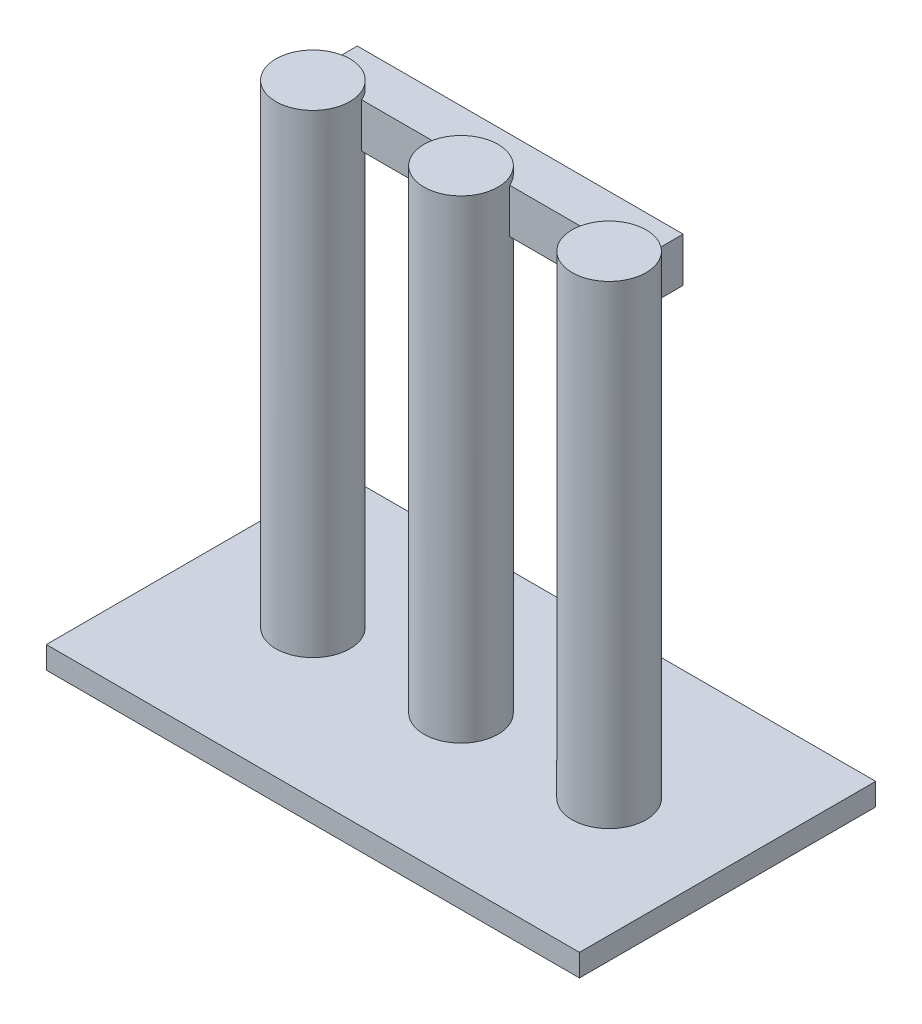
ISO-10303-21;
HEADER;
FILE_DESCRIPTION(('STEP AP214'),'2;1');
FILE_NAME('part.step','',(''),(''),'','','');
FILE_SCHEMA(('AUTOMOTIVE_DESIGN { 1 0 10303 214 1 1 1 1 }'));
ENDSEC;
DATA;
#1=APPLICATION_CONTEXT('core data for automotive mechanical design processes');
#2=APPLICATION_PROTOCOL_DEFINITION('international standard','automotive_design',2000,#1);
#3=PRODUCT_CONTEXT('',#1,'mechanical');
#4=PRODUCT('Part','Part','',(#3));
#5=PRODUCT_RELATED_PRODUCT_CATEGORY('part','',(#4));
#6=PRODUCT_DEFINITION_FORMATION('','',#4);
#7=PRODUCT_DEFINITION_CONTEXT('part definition',#1,'design');
#8=PRODUCT_DEFINITION('design','',#6,#7);
#9=PRODUCT_DEFINITION_SHAPE('','',#8);
#10=(LENGTH_UNIT() NAMED_UNIT(*) SI_UNIT(.MILLI.,.METRE.));
#11=(NAMED_UNIT(*) PLANE_ANGLE_UNIT() SI_UNIT($,.RADIAN.));
#12=(NAMED_UNIT(*) SI_UNIT($,.STERADIAN.) SOLID_ANGLE_UNIT());
#13=UNCERTAINTY_MEASURE_WITH_UNIT(LENGTH_MEASURE(1.E-05),#10,'distance_accuracy_value','');
#14=(GEOMETRIC_REPRESENTATION_CONTEXT(3) GLOBAL_UNCERTAINTY_ASSIGNED_CONTEXT((#13)) GLOBAL_UNIT_ASSIGNED_CONTEXT((#10,
#11,#12)) REPRESENTATION_CONTEXT('',''));
#15=CARTESIAN_POINT('',(0.,0.,0.));
#16=DIRECTION('',(0.,0.,1.));
#17=DIRECTION('',(1.,0.,0.));
#18=AXIS2_PLACEMENT_3D('',#15,#16,#17);
#19=CARTESIAN_POINT('',(-6500.,3350.,-4000.));
#20=DIRECTION('',(0.,-1.,0.));
#21=DIRECTION('',(0.,0.,-1.));
#22=AXIS2_PLACEMENT_3D('',#19,#20,#21);
#23=CYLINDRICAL_SURFACE('',#22,250.);
#24=CARTESIAN_POINT('',(-6500.,150.,-4000.));
#25=DIRECTION('',(0.,-1.,0.));
#26=DIRECTION('',(0.,0.,-1.));
#27=AXIS2_PLACEMENT_3D('',#24,#25,#26);
#28=CIRCLE('',#27,250.);
#29=CARTESIAN_POINT('',(-6500.,150.,-4250.));
#30=VERTEX_POINT('',#29);
#31=EDGE_CURVE('E217',#30,#30,#28,.F.);
#32=ORIENTED_EDGE('',*,*,#31,.T.);
#33=EDGE_LOOP('',(#32));
#34=FACE_BOUND('',#33,.T.);
#35=CARTESIAN_POINT('',(-6500.,3350.,-4000.));
#36=DIRECTION('',(0.,1.,0.));
#37=DIRECTION('',(0.,0.,1.));
#38=AXIS2_PLACEMENT_3D('',#35,#36,#37);
#39=CIRCLE('',#38,250.);
#40=CARTESIAN_POINT('',(-6500.,3350.,-3750.));
#41=VERTEX_POINT('',#40);
#42=EDGE_CURVE('E184',#41,#41,#39,.T.);
#43=ORIENTED_EDGE('',*,*,#42,.F.);
#44=EDGE_LOOP('',(#43));
#45=FACE_BOUND('',#44,.T.);
#46=CARTESIAN_POINT('',(-6500.,3300.,-4000.));
#47=DIRECTION('',(0.,-1.,0.));
#48=DIRECTION('',(0.,0.,-1.));
#49=AXIS2_PLACEMENT_3D('',#46,#47,#48);
#50=CIRCLE('',#49,250.);
#51=CARTESIAN_POINT('',(-6600.,3300.,-4229.12878474779));
#52=VERTEX_POINT('',#51);
#53=CARTESIAN_POINT('',(-6270.87121525221,3300.,-4100.));
#54=VERTEX_POINT('',#53);
#55=EDGE_CURVE('E170',#52,#54,#50,.T.);
#56=ORIENTED_EDGE('',*,*,#55,.F.);
#57=DIRECTION('',(0.,-1.,0.));
#58=VECTOR('',#57,1.);
#59=CARTESIAN_POINT('',(-6600.,3350.,-4229.12878474779));
#60=LINE('',#59,#58);
#61=CARTESIAN_POINT('',(-6600.,3000.,-4229.12878474779));
#62=VERTEX_POINT('',#61);
#63=EDGE_CURVE('E11',#62,#52,#60,.F.);
#64=ORIENTED_EDGE('',*,*,#63,.F.);
#65=CARTESIAN_POINT('',(-6500.,3000.,-4000.));
#66=DIRECTION('',(0.,-1.,0.));
#67=DIRECTION('',(0.,0.,-1.));
#68=AXIS2_PLACEMENT_3D('',#65,#66,#67);
#69=CIRCLE('',#68,250.);
#70=CARTESIAN_POINT('',(-6270.87121525221,3000.,-4100.));
#71=VERTEX_POINT('',#70);
#72=EDGE_CURVE('E165',#62,#71,#69,.T.);
#73=ORIENTED_EDGE('',*,*,#72,.T.);
#74=DIRECTION('',(0.,-1.,0.));
#75=VECTOR('',#74,1.);
#76=CARTESIAN_POINT('',(-6270.87121525221,3350.,-4100.));
#77=LINE('',#76,#75);
#78=EDGE_CURVE('E176',#54,#71,#77,.T.);
#79=ORIENTED_EDGE('',*,*,#78,.F.);
#80=EDGE_LOOP('',(#56,#64,#73,#79));
#81=FACE_BOUND('',#80,.T.);
#82=ADVANCED_FACE('F39',(#34,#45,#81),#23,.T.);
#83=CARTESIAN_POINT('',(-5500.,3350.,-4000.));
#84=DIRECTION('',(0.,-1.,0.));
#85=DIRECTION('',(0.,0.,-1.));
#86=AXIS2_PLACEMENT_3D('',#83,#84,#85);
#87=CYLINDRICAL_SURFACE('',#86,250.);
#88=CARTESIAN_POINT('',(-5500.,150.,-4000.));
#89=DIRECTION('',(0.,-1.,0.));
#90=DIRECTION('',(0.,0.,-1.));
#91=AXIS2_PLACEMENT_3D('',#88,#89,#90);
#92=CIRCLE('',#91,250.);
#93=CARTESIAN_POINT('',(-5500.,150.,-4250.));
#94=VERTEX_POINT('',#93);
#95=EDGE_CURVE('E220',#94,#94,#92,.F.);
#96=ORIENTED_EDGE('',*,*,#95,.T.);
#97=EDGE_LOOP('',(#96));
#98=FACE_BOUND('',#97,.T.);
#99=CARTESIAN_POINT('',(-5500.,3350.,-4000.));
#100=DIRECTION('',(0.,1.,0.));
#101=DIRECTION('',(0.,0.,1.));
#102=AXIS2_PLACEMENT_3D('',#99,#100,#101);
#103=CIRCLE('',#102,250.);
#104=CARTESIAN_POINT('',(-5500.,3350.,-3750.));
#105=VERTEX_POINT('',#104);
#106=EDGE_CURVE('E181',#105,#105,#103,.T.);
#107=ORIENTED_EDGE('',*,*,#106,.F.);
#108=EDGE_LOOP('',(#107));
#109=FACE_BOUND('',#108,.T.);
#110=CARTESIAN_POINT('',(-5500.,3300.,-4000.));
#111=DIRECTION('',(0.,-1.,0.));
#112=DIRECTION('',(0.,0.,-1.));
#113=AXIS2_PLACEMENT_3D('',#110,#111,#112);
#114=CIRCLE('',#113,250.);
#115=CARTESIAN_POINT('',(-5729.12878474779,3300.,-4100.));
#116=VERTEX_POINT('',#115);
#117=CARTESIAN_POINT('',(-5270.87121525221,3300.,-4100.));
#118=VERTEX_POINT('',#117);
#119=EDGE_CURVE('E168',#116,#118,#114,.T.);
#120=ORIENTED_EDGE('',*,*,#119,.F.);
#121=DIRECTION('',(0.,-1.,0.));
#122=VECTOR('',#121,1.);
#123=CARTESIAN_POINT('',(-5729.12878474779,3350.,-4100.));
#124=LINE('',#123,#122);
#125=CARTESIAN_POINT('',(-5729.12878474779,3000.,-4100.));
#126=VERTEX_POINT('',#125);
#127=EDGE_CURVE('E172',#126,#116,#124,.F.);
#128=ORIENTED_EDGE('',*,*,#127,.F.);
#129=CARTESIAN_POINT('',(-5500.,3000.,-4000.));
#130=DIRECTION('',(0.,-1.,0.));
#131=DIRECTION('',(0.,0.,-1.));
#132=AXIS2_PLACEMENT_3D('',#129,#130,#131);
#133=CIRCLE('',#132,250.);
#134=CARTESIAN_POINT('',(-5270.87121525221,3000.,-4100.));
#135=VERTEX_POINT('',#134);
#136=EDGE_CURVE('E145',#126,#135,#133,.T.);
#137=ORIENTED_EDGE('',*,*,#136,.T.);
#138=DIRECTION('',(0.,-1.,0.));
#139=VECTOR('',#138,1.);
#140=CARTESIAN_POINT('',(-5270.87121525221,3350.,-4100.));
#141=LINE('',#140,#139);
#142=EDGE_CURVE('E174',#118,#135,#141,.T.);
#143=ORIENTED_EDGE('',*,*,#142,.F.);
#144=EDGE_LOOP('',(#120,#128,#137,#143));
#145=FACE_BOUND('',#144,.T.);
#146=ADVANCED_FACE('F256',(#98,#109,#145),#87,.T.);
#147=CARTESIAN_POINT('',(-4500.,3350.,-4000.));
#148=DIRECTION('',(0.,-1.,0.));
#149=DIRECTION('',(0.,0.,-1.));
#150=AXIS2_PLACEMENT_3D('',#147,#148,#149);
#151=CYLINDRICAL_SURFACE('',#150,250.);
#152=CARTESIAN_POINT('',(-4500.,150.,-4000.));
#153=DIRECTION('',(0.,-1.,0.));
#154=DIRECTION('',(0.,0.,-1.));
#155=AXIS2_PLACEMENT_3D('',#152,#153,#154);
#156=CIRCLE('',#155,250.);
#157=CARTESIAN_POINT('',(-4500.,150.,-4250.));
#158=VERTEX_POINT('',#157);
#159=EDGE_CURVE('E223',#158,#158,#156,.F.);
#160=ORIENTED_EDGE('',*,*,#159,.T.);
#161=EDGE_LOOP('',(#160));
#162=FACE_BOUND('',#161,.T.);
#163=CARTESIAN_POINT('',(-4500.,3350.,-4000.));
#164=DIRECTION('',(0.,1.,0.));
#165=DIRECTION('',(0.,0.,1.));
#166=AXIS2_PLACEMENT_3D('',#163,#164,#165);
#167=CIRCLE('',#166,250.);
#168=CARTESIAN_POINT('',(-4500.,3350.,-3750.));
#169=VERTEX_POINT('',#168);
#170=EDGE_CURVE('E178',#169,#169,#167,.T.);
#171=ORIENTED_EDGE('',*,*,#170,.F.);
#172=EDGE_LOOP('',(#171));
#173=FACE_BOUND('',#172,.T.);
#174=CARTESIAN_POINT('',(-4500.,3300.,-4000.));
#175=DIRECTION('',(0.,-1.,0.));
#176=DIRECTION('',(0.,0.,-1.));
#177=AXIS2_PLACEMENT_3D('',#174,#175,#176);
#178=CIRCLE('',#177,250.);
#179=CARTESIAN_POINT('',(-4729.12878474779,3300.,-4100.));
#180=VERTEX_POINT('',#179);
#181=CARTESIAN_POINT('',(-4400.,3300.,-4229.12878474779));
#182=VERTEX_POINT('',#181);
#183=EDGE_CURVE('E47',#180,#182,#178,.T.);
#184=ORIENTED_EDGE('',*,*,#183,.F.);
#185=DIRECTION('',(0.,-1.,0.));
#186=VECTOR('',#185,1.);
#187=CARTESIAN_POINT('',(-4729.12878474779,3350.,-4100.));
#188=LINE('',#187,#186);
#189=CARTESIAN_POINT('',(-4729.12878474779,3000.,-4100.));
#190=VERTEX_POINT('',#189);
#191=EDGE_CURVE('E231',#190,#180,#188,.F.);
#192=ORIENTED_EDGE('',*,*,#191,.F.);
#193=CARTESIAN_POINT('',(-4500.,3000.,-4000.));
#194=DIRECTION('',(0.,-1.,0.));
#195=DIRECTION('',(0.,0.,-1.));
#196=AXIS2_PLACEMENT_3D('',#193,#194,#195);
#197=CIRCLE('',#196,250.);
#198=CARTESIAN_POINT('',(-4400.,3000.,-4229.12878474779));
#199=VERTEX_POINT('',#198);
#200=EDGE_CURVE('E226',#190,#199,#197,.T.);
#201=ORIENTED_EDGE('',*,*,#200,.T.);
#202=DIRECTION('',(0.,-1.,0.));
#203=VECTOR('',#202,1.);
#204=CARTESIAN_POINT('',(-4400.,3350.,-4229.12878474779));
#205=LINE('',#204,#203);
#206=EDGE_CURVE('E229',#182,#199,#205,.T.);
#207=ORIENTED_EDGE('',*,*,#206,.F.);
#208=EDGE_LOOP('',(#184,#192,#201,#207));
#209=FACE_BOUND('',#208,.T.);
#210=ADVANCED_FACE('F241',(#162,#173,#209),#151,.T.);
#211=CARTESIAN_POINT('',(-7300.,150.,-3000.));
#212=DIRECTION('',(1.,0.,0.));
#213=DIRECTION('',(0.,0.,-1.));
#214=AXIS2_PLACEMENT_3D('',#211,#212,#213);
#215=PLANE('',#214);
#216=DIRECTION('',(0.,0.,1.));
#217=VECTOR('',#216,1.);
#218=CARTESIAN_POINT('',(-7300.,0.,-3000.));
#219=LINE('',#218,#217);
#220=CARTESIAN_POINT('',(-7300.,0.,-5000.));
#221=VERTEX_POINT('',#220);
#222=CARTESIAN_POINT('',(-7300.,0.,-3000.));
#223=VERTEX_POINT('',#222);
#224=EDGE_CURVE('E187',#221,#223,#219,.T.);
#225=ORIENTED_EDGE('',*,*,#224,.T.);
#226=DIRECTION('',(0.,-1.,0.));
#227=VECTOR('',#226,1.);
#228=CARTESIAN_POINT('',(-7300.,150.,-3000.));
#229=LINE('',#228,#227);
#230=CARTESIAN_POINT('',(-7300.,150.,-3000.));
#231=VERTEX_POINT('',#230);
#232=EDGE_CURVE('E214',#231,#223,#229,.T.);
#233=ORIENTED_EDGE('',*,*,#232,.F.);
#234=DIRECTION('',(0.,0.,1.));
#235=VECTOR('',#234,1.);
#236=CARTESIAN_POINT('',(-7300.,150.,-3000.));
#237=LINE('',#236,#235);
#238=CARTESIAN_POINT('',(-7300.,150.,-5000.));
#239=VERTEX_POINT('',#238);
#240=EDGE_CURVE('E188',#239,#231,#237,.T.);
#241=ORIENTED_EDGE('',*,*,#240,.F.);
#242=DIRECTION('',(0.,-1.,0.));
#243=VECTOR('',#242,1.);
#244=CARTESIAN_POINT('',(-7300.,150.,-5000.));
#245=LINE('',#244,#243);
#246=EDGE_CURVE('E198',#239,#221,#245,.T.);
#247=ORIENTED_EDGE('',*,*,#246,.T.);
#248=EDGE_LOOP('',(#225,#233,#241,#247));
#249=FACE_BOUND('',#248,.T.);
#250=ADVANCED_FACE('F41',(#249),#215,.F.);
#251=CARTESIAN_POINT('',(-7300.,150.,-3000.));
#252=DIRECTION('',(0.,0.,-1.));
#253=DIRECTION('',(-1.,0.,0.));
#254=AXIS2_PLACEMENT_3D('',#251,#252,#253);
#255=PLANE('',#254);
#256=DIRECTION('',(1.,0.,0.));
#257=VECTOR('',#256,1.);
#258=CARTESIAN_POINT('',(-7300.,0.,-3000.));
#259=LINE('',#258,#257);
#260=CARTESIAN_POINT('',(-3700.,0.,-3000.));
#261=VERTEX_POINT('',#260);
#262=EDGE_CURVE('E201',#223,#261,#259,.T.);
#263=ORIENTED_EDGE('',*,*,#262,.T.);
#264=DIRECTION('',(0.,-1.,0.));
#265=VECTOR('',#264,1.);
#266=CARTESIAN_POINT('',(-3700.,150.,-3000.));
#267=LINE('',#266,#265);
#268=CARTESIAN_POINT('',(-3700.,150.,-3000.));
#269=VERTEX_POINT('',#268);
#270=EDGE_CURVE('E211',#269,#261,#267,.T.);
#271=ORIENTED_EDGE('',*,*,#270,.F.);
#272=DIRECTION('',(1.,0.,0.));
#273=VECTOR('',#272,1.);
#274=CARTESIAN_POINT('',(-7300.,150.,-3000.));
#275=LINE('',#274,#273);
#276=EDGE_CURVE('E191',#231,#269,#275,.T.);
#277=ORIENTED_EDGE('',*,*,#276,.F.);
#278=ORIENTED_EDGE('',*,*,#232,.T.);
#279=EDGE_LOOP('',(#263,#271,#277,#278));
#280=FACE_BOUND('',#279,.T.);
#281=ADVANCED_FACE('F290',(#280),#255,.F.);
#282=CARTESIAN_POINT('',(-3700.,150.,-3000.));
#283=DIRECTION('',(-1.,0.,0.));
#284=DIRECTION('',(0.,0.,1.));
#285=AXIS2_PLACEMENT_3D('',#282,#283,#284);
#286=PLANE('',#285);
#287=DIRECTION('',(0.,0.,-1.));
#288=VECTOR('',#287,1.);
#289=CARTESIAN_POINT('',(-3700.,0.,-3000.));
#290=LINE('',#289,#288);
#291=CARTESIAN_POINT('',(-3700.,0.,-5000.));
#292=VERTEX_POINT('',#291);
#293=EDGE_CURVE('E203',#261,#292,#290,.T.);
#294=ORIENTED_EDGE('',*,*,#293,.T.);
#295=DIRECTION('',(0.,-1.,0.));
#296=VECTOR('',#295,1.);
#297=CARTESIAN_POINT('',(-3700.,150.,-5000.));
#298=LINE('',#297,#296);
#299=CARTESIAN_POINT('',(-3700.,150.,-5000.));
#300=VERTEX_POINT('',#299);
#301=EDGE_CURVE('E208',#300,#292,#298,.T.);
#302=ORIENTED_EDGE('',*,*,#301,.F.);
#303=DIRECTION('',(0.,0.,-1.));
#304=VECTOR('',#303,1.);
#305=CARTESIAN_POINT('',(-3700.,150.,-3000.));
#306=LINE('',#305,#304);
#307=EDGE_CURVE('E194',#269,#300,#306,.T.);
#308=ORIENTED_EDGE('',*,*,#307,.F.);
#309=ORIENTED_EDGE('',*,*,#270,.T.);
#310=EDGE_LOOP('',(#294,#302,#308,#309));
#311=FACE_BOUND('',#310,.T.);
#312=ADVANCED_FACE('F287',(#311),#286,.F.);
#313=CARTESIAN_POINT('',(-7300.,150.,-5000.));
#314=DIRECTION('',(0.,0.,1.));
#315=DIRECTION('',(1.,0.,0.));
#316=AXIS2_PLACEMENT_3D('',#313,#314,#315);
#317=PLANE('',#316);
#318=DIRECTION('',(-1.,0.,0.));
#319=VECTOR('',#318,1.);
#320=CARTESIAN_POINT('',(-7300.,0.,-5000.));
#321=LINE('',#320,#319);
#322=EDGE_CURVE('E192',#292,#221,#321,.T.);
#323=ORIENTED_EDGE('',*,*,#322,.T.);
#324=ORIENTED_EDGE('',*,*,#246,.F.);
#325=DIRECTION('',(-1.,0.,0.));
#326=VECTOR('',#325,1.);
#327=CARTESIAN_POINT('',(-7300.,150.,-5000.));
#328=LINE('',#327,#326);
#329=EDGE_CURVE('E196',#300,#239,#328,.T.);
#330=ORIENTED_EDGE('',*,*,#329,.F.);
#331=ORIENTED_EDGE('',*,*,#301,.T.);
#332=EDGE_LOOP('',(#323,#324,#330,#331));
#333=FACE_BOUND('',#332,.T.);
#334=ADVANCED_FACE('F280',(#333),#317,.F.);
#335=CARTESIAN_POINT('',(0.,150.,0.));
#336=DIRECTION('',(0.,-1.,0.));
#337=DIRECTION('',(0.,0.,-1.));
#338=AXIS2_PLACEMENT_3D('',#335,#336,#337);
#339=PLANE('',#338);
#340=ORIENTED_EDGE('',*,*,#159,.F.);
#341=EDGE_LOOP('',(#340));
#342=FACE_BOUND('',#341,.T.);
#343=ORIENTED_EDGE('',*,*,#95,.F.);
#344=EDGE_LOOP('',(#343));
#345=FACE_BOUND('',#344,.T.);
#346=ORIENTED_EDGE('',*,*,#31,.F.);
#347=EDGE_LOOP('',(#346));
#348=FACE_BOUND('',#347,.T.);
#349=ORIENTED_EDGE('',*,*,#240,.T.);
#350=ORIENTED_EDGE('',*,*,#276,.T.);
#351=ORIENTED_EDGE('',*,*,#307,.T.);
#352=ORIENTED_EDGE('',*,*,#329,.T.);
#353=EDGE_LOOP('',(#349,#350,#351,#352));
#354=FACE_BOUND('',#353,.T.);
#355=ADVANCED_FACE('F277',(#342,#345,#348,#354),#339,.F.);
#356=CARTESIAN_POINT('',(0.,0.,0.));
#357=DIRECTION('',(0.,-1.,0.));
#358=DIRECTION('',(0.,0.,-1.));
#359=AXIS2_PLACEMENT_3D('',#356,#357,#358);
#360=PLANE('',#359);
#361=ORIENTED_EDGE('',*,*,#224,.F.);
#362=ORIENTED_EDGE('',*,*,#322,.F.);
#363=ORIENTED_EDGE('',*,*,#293,.F.);
#364=ORIENTED_EDGE('',*,*,#262,.F.);
#365=EDGE_LOOP('',(#361,#362,#363,#364));
#366=FACE_BOUND('',#365,.T.);
#367=ADVANCED_FACE('F274',(#366),#360,.T.);
#368=CARTESIAN_POINT('',(-6500.,3350.,-4000.));
#369=DIRECTION('',(0.,1.,0.));
#370=DIRECTION('',(0.,0.,1.));
#371=AXIS2_PLACEMENT_3D('',#368,#369,#370);
#372=PLANE('',#371);
#373=ORIENTED_EDGE('',*,*,#42,.T.);
#374=EDGE_LOOP('',(#373));
#375=FACE_BOUND('',#374,.T.);
#376=ADVANCED_FACE('F272',(#375),#372,.T.);
#377=CARTESIAN_POINT('',(-5500.,3350.,-4000.));
#378=DIRECTION('',(0.,1.,0.));
#379=DIRECTION('',(0.,0.,1.));
#380=AXIS2_PLACEMENT_3D('',#377,#378,#379);
#381=PLANE('',#380);
#382=ORIENTED_EDGE('',*,*,#106,.T.);
#383=EDGE_LOOP('',(#382));
#384=FACE_BOUND('',#383,.T.);
#385=ADVANCED_FACE('F271',(#384),#381,.T.);
#386=CARTESIAN_POINT('',(-4500.,3350.,-4000.));
#387=DIRECTION('',(0.,1.,0.));
#388=DIRECTION('',(0.,0.,1.));
#389=AXIS2_PLACEMENT_3D('',#386,#387,#388);
#390=PLANE('',#389);
#391=ORIENTED_EDGE('',*,*,#170,.T.);
#392=EDGE_LOOP('',(#391));
#393=FACE_BOUND('',#392,.T.);
#394=ADVANCED_FACE('F356',(#393),#390,.T.);
#395=CARTESIAN_POINT('',(-6600.,3300.,-4100.));
#396=DIRECTION('',(1.,0.,0.));
#397=DIRECTION('',(0.,0.,-1.));
#398=AXIS2_PLACEMENT_3D('',#395,#396,#397);
#399=PLANE('',#398);
#400=DIRECTION('',(0.,0.,1.));
#401=VECTOR('',#400,1.);
#402=CARTESIAN_POINT('',(-6600.,3000.,-4100.));
#403=LINE('',#402,#401);
#404=CARTESIAN_POINT('',(-6600.,3000.,-4400.));
#405=VERTEX_POINT('',#404);
#406=EDGE_CURVE('E155',#405,#62,#403,.T.);
#407=ORIENTED_EDGE('',*,*,#406,.T.);
#408=ORIENTED_EDGE('',*,*,#63,.T.);
#409=DIRECTION('',(0.,0.,1.));
#410=VECTOR('',#409,1.);
#411=CARTESIAN_POINT('',(-6600.,3300.,-4100.));
#412=LINE('',#411,#410);
#413=CARTESIAN_POINT('',(-6600.,3300.,-4400.));
#414=VERTEX_POINT('',#413);
#415=EDGE_CURVE('E161',#414,#52,#412,.T.);
#416=ORIENTED_EDGE('',*,*,#415,.F.);
#417=DIRECTION('',(0.,-1.,0.));
#418=VECTOR('',#417,1.);
#419=CARTESIAN_POINT('',(-6600.,3300.,-4400.));
#420=LINE('',#419,#418);
#421=EDGE_CURVE('E146',#414,#405,#420,.T.);
#422=ORIENTED_EDGE('',*,*,#421,.T.);
#423=EDGE_LOOP('',(#407,#408,#416,#422));
#424=FACE_BOUND('',#423,.T.);
#425=ADVANCED_FACE('F245',(#424),#399,.F.);
#426=CARTESIAN_POINT('',(-6600.,3300.,-4100.));
#427=DIRECTION('',(0.,0.,-1.));
#428=DIRECTION('',(-1.,0.,0.));
#429=AXIS2_PLACEMENT_3D('',#426,#427,#428);
#430=PLANE('',#429);
#431=DIRECTION('',(1.,0.,0.));
#432=VECTOR('',#431,1.);
#433=CARTESIAN_POINT('',(-6600.,3300.,-4100.));
#434=LINE('',#433,#432);
#435=EDGE_CURVE('E137',#54,#116,#434,.T.);
#436=ORIENTED_EDGE('',*,*,#435,.F.);
#437=ORIENTED_EDGE('',*,*,#78,.T.);
#438=DIRECTION('',(1.,0.,0.));
#439=VECTOR('',#438,1.);
#440=CARTESIAN_POINT('',(-6600.,3000.,-4100.));
#441=LINE('',#440,#439);
#442=EDGE_CURVE('E54',#71,#126,#441,.T.);
#443=ORIENTED_EDGE('',*,*,#442,.T.);
#444=ORIENTED_EDGE('',*,*,#127,.T.);
#445=EDGE_LOOP('',(#436,#437,#443,#444));
#446=FACE_BOUND('',#445,.T.);
#447=ADVANCED_FACE('F253',(#446),#430,.F.);
#448=EDGE_CURVE('E236',#118,#180,#434,.T.);
#449=ORIENTED_EDGE('',*,*,#448,.F.);
#450=ORIENTED_EDGE('',*,*,#142,.T.);
#451=EDGE_CURVE('E60',#135,#190,#441,.T.);
#452=ORIENTED_EDGE('',*,*,#451,.T.);
#453=ORIENTED_EDGE('',*,*,#191,.T.);
#454=EDGE_LOOP('',(#449,#450,#452,#453));
#455=FACE_BOUND('',#454,.T.);
#456=ADVANCED_FACE('F235',(#455),#430,.F.);
#457=CARTESIAN_POINT('',(-4400.,3300.,-4100.));
#458=DIRECTION('',(-1.,0.,0.));
#459=DIRECTION('',(0.,0.,1.));
#460=AXIS2_PLACEMENT_3D('',#457,#458,#459);
#461=PLANE('',#460);
#462=DIRECTION('',(0.,0.,-1.));
#463=VECTOR('',#462,1.);
#464=CARTESIAN_POINT('',(-4400.,3300.,-4100.));
#465=LINE('',#464,#463);
#466=CARTESIAN_POINT('',(-4400.,3300.,-4400.));
#467=VERTEX_POINT('',#466);
#468=EDGE_CURVE('E125',#182,#467,#465,.T.);
#469=ORIENTED_EDGE('',*,*,#468,.F.);
#470=ORIENTED_EDGE('',*,*,#206,.T.);
#471=DIRECTION('',(0.,0.,-1.));
#472=VECTOR('',#471,1.);
#473=CARTESIAN_POINT('',(-4400.,3000.,-4100.));
#474=LINE('',#473,#472);
#475=CARTESIAN_POINT('',(-4400.,3000.,-4400.));
#476=VERTEX_POINT('',#475);
#477=EDGE_CURVE('E142',#199,#476,#474,.T.);
#478=ORIENTED_EDGE('',*,*,#477,.T.);
#479=DIRECTION('',(0.,-1.,0.));
#480=VECTOR('',#479,1.);
#481=CARTESIAN_POINT('',(-4400.,3300.,-4400.));
#482=LINE('',#481,#480);
#483=EDGE_CURVE('E140',#467,#476,#482,.T.);
#484=ORIENTED_EDGE('',*,*,#483,.F.);
#485=EDGE_LOOP('',(#469,#470,#478,#484));
#486=FACE_BOUND('',#485,.T.);
#487=ADVANCED_FACE('F141',(#486),#461,.F.);
#488=CARTESIAN_POINT('',(-6600.,3300.,-4400.));
#489=DIRECTION('',(0.,0.,1.));
#490=DIRECTION('',(1.,0.,0.));
#491=AXIS2_PLACEMENT_3D('',#488,#489,#490);
#492=PLANE('',#491);
#493=DIRECTION('',(-1.,0.,0.));
#494=VECTOR('',#493,1.);
#495=CARTESIAN_POINT('',(-6600.,3000.,-4400.));
#496=LINE('',#495,#494);
#497=EDGE_CURVE('E160',#476,#405,#496,.T.);
#498=ORIENTED_EDGE('',*,*,#497,.T.);
#499=ORIENTED_EDGE('',*,*,#421,.F.);
#500=DIRECTION('',(-1.,0.,0.));
#501=VECTOR('',#500,1.);
#502=CARTESIAN_POINT('',(-6600.,3300.,-4400.));
#503=LINE('',#502,#501);
#504=EDGE_CURVE('E130',#467,#414,#503,.T.);
#505=ORIENTED_EDGE('',*,*,#504,.F.);
#506=ORIENTED_EDGE('',*,*,#483,.T.);
#507=EDGE_LOOP('',(#498,#499,#505,#506));
#508=FACE_BOUND('',#507,.T.);
#509=ADVANCED_FACE('F148',(#508),#492,.F.);
#510=CARTESIAN_POINT('',(0.,3300.,0.));
#511=DIRECTION('',(0.,-1.,0.));
#512=DIRECTION('',(0.,0.,-1.));
#513=AXIS2_PLACEMENT_3D('',#510,#511,#512);
#514=PLANE('',#513);
#515=ORIENTED_EDGE('',*,*,#415,.T.);
#516=ORIENTED_EDGE('',*,*,#55,.T.);
#517=ORIENTED_EDGE('',*,*,#435,.T.);
#518=ORIENTED_EDGE('',*,*,#119,.T.);
#519=ORIENTED_EDGE('',*,*,#448,.T.);
#520=ORIENTED_EDGE('',*,*,#183,.T.);
#521=ORIENTED_EDGE('',*,*,#468,.T.);
#522=ORIENTED_EDGE('',*,*,#504,.T.);
#523=EDGE_LOOP('',(#515,#516,#517,#518,#519,#520,#521,#522));
#524=FACE_BOUND('',#523,.T.);
#525=ADVANCED_FACE('F128',(#524),#514,.F.);
#526=CARTESIAN_POINT('',(0.,3000.,0.));
#527=DIRECTION('',(0.,-1.,0.));
#528=DIRECTION('',(0.,0.,-1.));
#529=AXIS2_PLACEMENT_3D('',#526,#527,#528);
#530=PLANE('',#529);
#531=ORIENTED_EDGE('',*,*,#72,.F.);
#532=ORIENTED_EDGE('',*,*,#406,.F.);
#533=ORIENTED_EDGE('',*,*,#497,.F.);
#534=ORIENTED_EDGE('',*,*,#477,.F.);
#535=ORIENTED_EDGE('',*,*,#200,.F.);
#536=ORIENTED_EDGE('',*,*,#451,.F.);
#537=ORIENTED_EDGE('',*,*,#136,.F.);
#538=ORIENTED_EDGE('',*,*,#442,.F.);
#539=EDGE_LOOP('',(#531,#532,#533,#534,#535,#536,#537,#538));
#540=FACE_BOUND('',#539,.T.);
#541=ADVANCED_FACE('F242',(#540),#530,.T.);
#542=CLOSED_SHELL('',(#82,#146,#210,#250,#281,#312,#334,#355,#367,#376,#385,#394,#425,#447,#456,
#487,#509,#525,#541));
#543=MANIFOLD_SOLID_BREP('B2',#542);
#544=ADVANCED_BREP_SHAPE_REPRESENTATION('',(#18,#543),#14);
#545=SHAPE_DEFINITION_REPRESENTATION(#9,#544);
ENDSEC;
END-ISO-10303-21;
